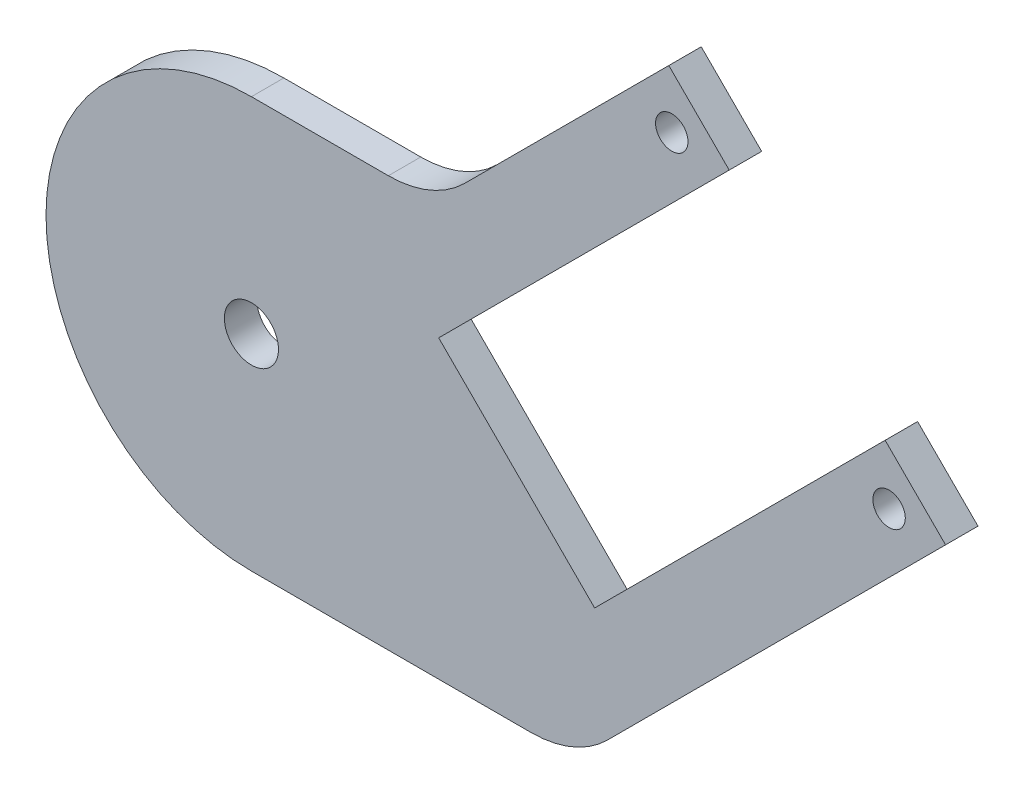
ISO-10303-21;
HEADER;
FILE_DESCRIPTION(('STEP AP214'),'2;1');
FILE_NAME('part.step','',(''),(''),'','','');
FILE_SCHEMA(('AUTOMOTIVE_DESIGN { 1 0 10303 214 1 1 1 1 }'));
ENDSEC;
DATA;
#1=APPLICATION_CONTEXT('core data for automotive mechanical design processes');
#2=APPLICATION_PROTOCOL_DEFINITION('international standard','automotive_design',2000,#1);
#3=PRODUCT_CONTEXT('',#1,'mechanical');
#4=PRODUCT('Part','Part','',(#3));
#5=PRODUCT_RELATED_PRODUCT_CATEGORY('part','',(#4));
#6=PRODUCT_DEFINITION_FORMATION('','',#4);
#7=PRODUCT_DEFINITION_CONTEXT('part definition',#1,'design');
#8=PRODUCT_DEFINITION('design','',#6,#7);
#9=PRODUCT_DEFINITION_SHAPE('','',#8);
#10=(LENGTH_UNIT() NAMED_UNIT(*) SI_UNIT(.MILLI.,.METRE.));
#11=(NAMED_UNIT(*) PLANE_ANGLE_UNIT() SI_UNIT($,.RADIAN.));
#12=(NAMED_UNIT(*) SI_UNIT($,.STERADIAN.) SOLID_ANGLE_UNIT());
#13=UNCERTAINTY_MEASURE_WITH_UNIT(LENGTH_MEASURE(1.E-05),#10,'distance_accuracy_value','');
#14=(GEOMETRIC_REPRESENTATION_CONTEXT(3) GLOBAL_UNCERTAINTY_ASSIGNED_CONTEXT((#13)) GLOBAL_UNIT_ASSIGNED_CONTEXT((#10,
#11,#12)) REPRESENTATION_CONTEXT('',''));
#15=CARTESIAN_POINT('',(0.,0.,0.));
#16=DIRECTION('',(0.,0.,1.));
#17=DIRECTION('',(1.,0.,0.));
#18=AXIS2_PLACEMENT_3D('',#15,#16,#17);
#19=CARTESIAN_POINT('',(0.,0.,3.));
#20=DIRECTION('',(0.,0.,1.));
#21=DIRECTION('',(1.,0.,0.));
#22=AXIS2_PLACEMENT_3D('',#19,#20,#21);
#23=PLANE('',#22);
#24=CARTESIAN_POINT('',(58.9776159145091,15.4753711382337,3.));
#25=DIRECTION('',(0.,0.,1.));
#26=DIRECTION('',(1.,0.,0.));
#27=AXIS2_PLACEMENT_3D('',#24,#25,#26);
#28=CIRCLE('',#27,1.5);
#29=CARTESIAN_POINT('',(60.4776159145091,15.4753711382337,3.));
#30=VERTEX_POINT('',#29);
#31=EDGE_CURVE('E291',#30,#30,#28,.T.);
#32=ORIENTED_EDGE('',*,*,#31,.F.);
#33=EDGE_LOOP('',(#32));
#34=FACE_BOUND('',#33,.T.);
#35=CARTESIAN_POINT('',(38.8781056592815,35.5748813934614,3.));
#36=DIRECTION('',(0.,0.,1.));
#37=DIRECTION('',(1.,0.,0.));
#38=AXIS2_PLACEMENT_3D('',#35,#36,#37);
#39=CIRCLE('',#38,1.5);
#40=CARTESIAN_POINT('',(40.3781056592815,35.5748813934614,3.));
#41=VERTEX_POINT('',#40);
#42=EDGE_CURVE('E293',#41,#41,#39,.T.);
#43=ORIENTED_EDGE('',*,*,#42,.F.);
#44=EDGE_LOOP('',(#43));
#45=FACE_BOUND('',#44,.T.);
#46=DIRECTION('',(1.,0.,0.));
#47=VECTOR('',#46,1.);
#48=CARTESIAN_POINT('',(0.,-19.,3.));
#49=LINE('',#48,#47);
#50=CARTESIAN_POINT('',(0.,-19.,3.));
#51=VERTEX_POINT('',#50);
#52=CARTESIAN_POINT('',(25.857864376269,-18.9999999999997,3.));
#53=VERTEX_POINT('',#52);
#54=EDGE_CURVE('E191',#51,#53,#49,.T.);
#55=ORIENTED_EDGE('',*,*,#54,.T.);
#56=CARTESIAN_POINT('',(25.8578643762689,-8.99999999999968,3.));
#57=DIRECTION('',(0.,0.,1.));
#58=DIRECTION('',(1.,0.,0.));
#59=AXIS2_PLACEMENT_3D('',#56,#57,#58);
#60=CIRCLE('',#59,10.);
#61=CARTESIAN_POINT('',(32.9289321881341,-16.0710678118654,3.));
#62=VERTEX_POINT('',#61);
#63=EDGE_CURVE('E164',#53,#62,#60,.T.);
#64=ORIENTED_EDGE('',*,*,#63,.T.);
#65=DIRECTION('',(0.707106781186574,0.707106781186521,0.));
#66=VECTOR('',#65,1.);
#67=CARTESIAN_POINT('',(29.9999999999996,-18.9999999999996,3.));
#68=LINE('',#67,#66);
#69=CARTESIAN_POINT('',(64.2013672605249,15.201367260523,3.));
#70=VERTEX_POINT('',#69);
#71=EDGE_CURVE('E196',#62,#70,#68,.T.);
#72=ORIENTED_EDGE('',*,*,#71,.T.);
#73=DIRECTION('',(-0.707106781186531,0.707106781186563,0.));
#74=VECTOR('',#73,1.);
#75=CARTESIAN_POINT('',(64.2013672605249,15.201367260523,3.));
#76=LINE('',#75,#74);
#77=CARTESIAN_POINT('',(58.6152236891513,20.7875108318968,3.));
#78=VERTEX_POINT('',#77);
#79=EDGE_CURVE('E198',#70,#78,#76,.T.);
#80=ORIENTED_EDGE('',*,*,#79,.T.);
#81=DIRECTION('',(-0.707106781186562,-0.707106781186533,0.));
#82=VECTOR('',#81,1.);
#83=CARTESIAN_POINT('',(31.745166004062,-6.08254685319135,3.));
#84=LINE('',#83,#82);
#85=CARTESIAN_POINT('',(31.745166004062,-6.08254685319135,3.));
#86=VERTEX_POINT('',#85);
#87=EDGE_CURVE('E200',#78,#86,#84,.T.);
#88=ORIENTED_EDGE('',*,*,#87,.T.);
#89=DIRECTION('',(-0.707106781186544,0.707106781186551,0.));
#90=VECTOR('',#89,1.);
#91=CARTESIAN_POINT('',(17.3201876678565,8.34243148301427,3.));
#92=LINE('',#91,#90);
#93=CARTESIAN_POINT('',(17.3201876678565,8.34243148301427,3.));
#94=VERTEX_POINT('',#93);
#95=EDGE_CURVE('E140',#86,#94,#92,.T.);
#96=ORIENTED_EDGE('',*,*,#95,.T.);
#97=DIRECTION('',(0.707106781186562,0.707106781186533,0.));
#98=VECTOR('',#97,1.);
#99=CARTESIAN_POINT('',(17.3201876678565,8.34243148301427,3.));
#100=LINE('',#99,#98);
#101=CARTESIAN_POINT('',(44.190245352946,35.2124891681027,3.));
#102=VERTEX_POINT('',#101);
#103=EDGE_CURVE('E135',#94,#102,#100,.T.);
#104=ORIENTED_EDGE('',*,*,#103,.T.);
#105=DIRECTION('',(-0.707106781186533,0.707106781186562,0.));
#106=VECTOR('',#105,1.);
#107=CARTESIAN_POINT('',(44.190245352946,35.2124891681027,3.));
#108=LINE('',#107,#106);
#109=CARTESIAN_POINT('',(38.6041017815724,40.7986327394765,3.));
#110=VERTEX_POINT('',#109);
#111=EDGE_CURVE('E123',#102,#110,#108,.T.);
#112=ORIENTED_EDGE('',*,*,#111,.T.);
#113=DIRECTION('',(-0.707106781186543,-0.707106781186552,0.));
#114=VECTOR('',#113,1.);
#115=CARTESIAN_POINT('',(38.6041017815724,40.7986327394765,3.));
#116=LINE('',#115,#114);
#117=CARTESIAN_POINT('',(19.7344012302307,21.9289321881346,3.));
#118=VERTEX_POINT('',#117);
#119=EDGE_CURVE('E134',#110,#118,#116,.T.);
#120=ORIENTED_EDGE('',*,*,#119,.T.);
#121=CARTESIAN_POINT('',(12.6633334183652,29.,3.));
#122=DIRECTION('',(0.,0.,1.));
#123=DIRECTION('',(1.,0.,0.));
#124=AXIS2_PLACEMENT_3D('',#121,#122,#123);
#125=CIRCLE('',#124,10.);
#126=CARTESIAN_POINT('',(12.6633334183652,19.,3.));
#127=VERTEX_POINT('',#126);
#128=EDGE_CURVE('E11',#118,#127,#125,.F.);
#129=ORIENTED_EDGE('',*,*,#128,.T.);
#130=DIRECTION('',(-1.,0.,0.));
#131=VECTOR('',#130,1.);
#132=CARTESIAN_POINT('',(16.8054690420962,19.,3.));
#133=LINE('',#132,#131);
#134=CARTESIAN_POINT('',(0.,19.,3.));
#135=VERTEX_POINT('',#134);
#136=EDGE_CURVE('E183',#127,#135,#133,.T.);
#137=ORIENTED_EDGE('',*,*,#136,.T.);
#138=CARTESIAN_POINT('',(0.,0.,3.));
#139=DIRECTION('',(0.,0.,1.));
#140=DIRECTION('',(1.,0.,0.));
#141=AXIS2_PLACEMENT_3D('',#138,#139,#140);
#142=CIRCLE('',#141,19.);
#143=EDGE_CURVE('E189',#135,#51,#142,.T.);
#144=ORIENTED_EDGE('',*,*,#143,.T.);
#145=EDGE_LOOP('',(#55,#64,#72,#80,#88,#96,#104,#112,#120,#129,#137,#144));
#146=FACE_BOUND('',#145,.T.);
#147=CARTESIAN_POINT('',(0.,0.,3.));
#148=DIRECTION('',(0.,0.,1.));
#149=DIRECTION('',(1.,0.,0.));
#150=AXIS2_PLACEMENT_3D('',#147,#148,#149);
#151=CIRCLE('',#150,2.5);
#152=CARTESIAN_POINT('',(2.5,0.,3.));
#153=VERTEX_POINT('',#152);
#154=EDGE_CURVE('E205',#153,#153,#151,.T.);
#155=ORIENTED_EDGE('',*,*,#154,.F.);
#156=EDGE_LOOP('',(#155));
#157=FACE_BOUND('',#156,.T.);
#158=ADVANCED_FACE('F33',(#34,#45,#146,#157),#23,.T.);
#159=CARTESIAN_POINT('',(0.,0.,0.));
#160=DIRECTION('',(0.,0.,1.));
#161=DIRECTION('',(1.,0.,0.));
#162=AXIS2_PLACEMENT_3D('',#159,#160,#161);
#163=PLANE('',#162);
#164=CARTESIAN_POINT('',(58.9776159145091,15.4753711382337,0.));
#165=DIRECTION('',(0.,0.,1.));
#166=DIRECTION('',(1.,0.,0.));
#167=AXIS2_PLACEMENT_3D('',#164,#165,#166);
#168=CIRCLE('',#167,1.5);
#169=CARTESIAN_POINT('',(60.4776159145091,15.4753711382337,0.));
#170=VERTEX_POINT('',#169);
#171=EDGE_CURVE('E289',#170,#170,#168,.T.);
#172=ORIENTED_EDGE('',*,*,#171,.T.);
#173=EDGE_LOOP('',(#172));
#174=FACE_BOUND('',#173,.T.);
#175=CARTESIAN_POINT('',(38.8781056592815,35.5748813934614,0.));
#176=DIRECTION('',(0.,0.,1.));
#177=DIRECTION('',(1.,0.,0.));
#178=AXIS2_PLACEMENT_3D('',#175,#176,#177);
#179=CIRCLE('',#178,1.5);
#180=CARTESIAN_POINT('',(40.3781056592815,35.5748813934614,0.));
#181=VERTEX_POINT('',#180);
#182=EDGE_CURVE('E296',#181,#181,#179,.T.);
#183=ORIENTED_EDGE('',*,*,#182,.T.);
#184=EDGE_LOOP('',(#183));
#185=FACE_BOUND('',#184,.T.);
#186=DIRECTION('',(0.707106781186574,0.707106781186521,0.));
#187=VECTOR('',#186,1.);
#188=CARTESIAN_POINT('',(29.9999999999996,-18.9999999999996,0.));
#189=LINE('',#188,#187);
#190=CARTESIAN_POINT('',(32.9289321881341,-16.0710678118654,0.));
#191=VERTEX_POINT('',#190);
#192=CARTESIAN_POINT('',(64.2013672605249,15.201367260523,0.));
#193=VERTEX_POINT('',#192);
#194=EDGE_CURVE('E212',#191,#193,#189,.T.);
#195=ORIENTED_EDGE('',*,*,#194,.F.);
#196=CARTESIAN_POINT('',(25.8578643762689,-8.99999999999968,0.));
#197=DIRECTION('',(0.,0.,1.));
#198=DIRECTION('',(1.,0.,0.));
#199=AXIS2_PLACEMENT_3D('',#196,#197,#198);
#200=CIRCLE('',#199,10.);
#201=CARTESIAN_POINT('',(25.857864376269,-18.9999999999997,0.));
#202=VERTEX_POINT('',#201);
#203=EDGE_CURVE('E56',#191,#202,#200,.F.);
#204=ORIENTED_EDGE('',*,*,#203,.T.);
#205=DIRECTION('',(1.,0.,0.));
#206=VECTOR('',#205,1.);
#207=CARTESIAN_POINT('',(0.,-19.,0.));
#208=LINE('',#207,#206);
#209=CARTESIAN_POINT('',(0.,-19.,0.));
#210=VERTEX_POINT('',#209);
#211=EDGE_CURVE('E210',#210,#202,#208,.T.);
#212=ORIENTED_EDGE('',*,*,#211,.F.);
#213=CARTESIAN_POINT('',(0.,0.,0.));
#214=DIRECTION('',(0.,0.,1.));
#215=DIRECTION('',(1.,0.,0.));
#216=AXIS2_PLACEMENT_3D('',#213,#214,#215);
#217=CIRCLE('',#216,19.);
#218=CARTESIAN_POINT('',(0.,19.,0.));
#219=VERTEX_POINT('',#218);
#220=EDGE_CURVE('E208',#219,#210,#217,.T.);
#221=ORIENTED_EDGE('',*,*,#220,.F.);
#222=DIRECTION('',(-1.,0.,0.));
#223=VECTOR('',#222,1.);
#224=CARTESIAN_POINT('',(16.8054690420962,19.,0.));
#225=LINE('',#224,#223);
#226=CARTESIAN_POINT('',(12.6633334183652,19.,0.));
#227=VERTEX_POINT('',#226);
#228=EDGE_CURVE('E172',#227,#219,#225,.T.);
#229=ORIENTED_EDGE('',*,*,#228,.F.);
#230=CARTESIAN_POINT('',(12.6633334183652,29.,0.));
#231=DIRECTION('',(0.,0.,1.));
#232=DIRECTION('',(1.,0.,0.));
#233=AXIS2_PLACEMENT_3D('',#230,#231,#232);
#234=CIRCLE('',#233,10.);
#235=CARTESIAN_POINT('',(19.7344012302307,21.9289321881346,0.));
#236=VERTEX_POINT('',#235);
#237=EDGE_CURVE('E41',#227,#236,#234,.T.);
#238=ORIENTED_EDGE('',*,*,#237,.T.);
#239=DIRECTION('',(-0.707106781186543,-0.707106781186552,0.));
#240=VECTOR('',#239,1.);
#241=CARTESIAN_POINT('',(38.6041017815724,40.7986327394765,0.));
#242=LINE('',#241,#240);
#243=CARTESIAN_POINT('',(38.6041017815724,40.7986327394765,0.));
#244=VERTEX_POINT('',#243);
#245=EDGE_CURVE('E170',#244,#236,#242,.T.);
#246=ORIENTED_EDGE('',*,*,#245,.F.);
#247=DIRECTION('',(-0.707106781186533,0.707106781186562,0.));
#248=VECTOR('',#247,1.);
#249=CARTESIAN_POINT('',(44.190245352946,35.2124891681027,0.));
#250=LINE('',#249,#248);
#251=CARTESIAN_POINT('',(44.190245352946,35.2124891681027,0.));
#252=VERTEX_POINT('',#251);
#253=EDGE_CURVE('E178',#252,#244,#250,.T.);
#254=ORIENTED_EDGE('',*,*,#253,.F.);
#255=DIRECTION('',(0.707106781186562,0.707106781186533,0.));
#256=VECTOR('',#255,1.);
#257=CARTESIAN_POINT('',(17.3201876678565,8.34243148301427,0.));
#258=LINE('',#257,#256);
#259=CARTESIAN_POINT('',(17.3201876678565,8.34243148301427,0.));
#260=VERTEX_POINT('',#259);
#261=EDGE_CURVE('E148',#260,#252,#258,.T.);
#262=ORIENTED_EDGE('',*,*,#261,.F.);
#263=DIRECTION('',(-0.707106781186544,0.707106781186551,0.));
#264=VECTOR('',#263,1.);
#265=CARTESIAN_POINT('',(17.3201876678565,8.34243148301427,0.));
#266=LINE('',#265,#264);
#267=CARTESIAN_POINT('',(31.745166004062,-6.08254685319135,0.));
#268=VERTEX_POINT('',#267);
#269=EDGE_CURVE('E144',#268,#260,#266,.T.);
#270=ORIENTED_EDGE('',*,*,#269,.F.);
#271=DIRECTION('',(-0.707106781186562,-0.707106781186533,0.));
#272=VECTOR('',#271,1.);
#273=CARTESIAN_POINT('',(31.745166004062,-6.08254685319135,0.));
#274=LINE('',#273,#272);
#275=CARTESIAN_POINT('',(58.6152236891513,20.7875108318968,0.));
#276=VERTEX_POINT('',#275);
#277=EDGE_CURVE('E216',#276,#268,#274,.T.);
#278=ORIENTED_EDGE('',*,*,#277,.F.);
#279=DIRECTION('',(-0.707106781186531,0.707106781186563,0.));
#280=VECTOR('',#279,1.);
#281=CARTESIAN_POINT('',(64.2013672605249,15.201367260523,0.));
#282=LINE('',#281,#280);
#283=EDGE_CURVE('E214',#193,#276,#282,.T.);
#284=ORIENTED_EDGE('',*,*,#283,.F.);
#285=EDGE_LOOP('',(#195,#204,#212,#221,#229,#238,#246,#254,#262,#270,#278,#284));
#286=FACE_BOUND('',#285,.T.);
#287=CARTESIAN_POINT('',(0.,0.,0.));
#288=DIRECTION('',(0.,0.,1.));
#289=DIRECTION('',(1.,0.,0.));
#290=AXIS2_PLACEMENT_3D('',#287,#288,#289);
#291=CIRCLE('',#290,2.5);
#292=CARTESIAN_POINT('',(2.5,0.,0.));
#293=VERTEX_POINT('',#292);
#294=EDGE_CURVE('E299',#293,#293,#291,.T.);
#295=ORIENTED_EDGE('',*,*,#294,.T.);
#296=EDGE_LOOP('',(#295));
#297=FACE_BOUND('',#296,.T.);
#298=ADVANCED_FACE('F168',(#174,#185,#286,#297),#163,.F.);
#299=CARTESIAN_POINT('',(17.3201876678565,8.34243148301427,3.));
#300=DIRECTION('',(-0.707106781186533,0.707106781186562,0.));
#301=DIRECTION('',(-0.707106781186562,-0.707106781186533,0.));
#302=AXIS2_PLACEMENT_3D('',#299,#300,#301);
#303=PLANE('',#302);
#304=ORIENTED_EDGE('',*,*,#261,.T.);
#305=DIRECTION('',(0.,0.,-1.));
#306=VECTOR('',#305,1.);
#307=CARTESIAN_POINT('',(44.190245352946,35.2124891681027,3.));
#308=LINE('',#307,#306);
#309=EDGE_CURVE('E127',#102,#252,#308,.T.);
#310=ORIENTED_EDGE('',*,*,#309,.F.);
#311=ORIENTED_EDGE('',*,*,#103,.F.);
#312=DIRECTION('',(0.,0.,-1.));
#313=VECTOR('',#312,1.);
#314=CARTESIAN_POINT('',(17.3201876678565,8.34243148301427,3.));
#315=LINE('',#314,#313);
#316=EDGE_CURVE('E203',#94,#260,#315,.T.);
#317=ORIENTED_EDGE('',*,*,#316,.T.);
#318=EDGE_LOOP('',(#304,#310,#311,#317));
#319=FACE_BOUND('',#318,.T.);
#320=ADVANCED_FACE('F146',(#319),#303,.F.);
#321=CARTESIAN_POINT('',(44.190245352946,35.2124891681027,3.));
#322=DIRECTION('',(-0.707106781186562,-0.707106781186533,0.));
#323=DIRECTION('',(0.707106781186533,-0.707106781186562,0.));
#324=AXIS2_PLACEMENT_3D('',#321,#322,#323);
#325=PLANE('',#324);
#326=ORIENTED_EDGE('',*,*,#253,.T.);
#327=DIRECTION('',(0.,0.,-1.));
#328=VECTOR('',#327,1.);
#329=CARTESIAN_POINT('',(38.6041017815724,40.7986327394765,3.));
#330=LINE('',#329,#328);
#331=EDGE_CURVE('E130',#110,#244,#330,.T.);
#332=ORIENTED_EDGE('',*,*,#331,.F.);
#333=ORIENTED_EDGE('',*,*,#111,.F.);
#334=ORIENTED_EDGE('',*,*,#309,.T.);
#335=EDGE_LOOP('',(#326,#332,#333,#334));
#336=FACE_BOUND('',#335,.T.);
#337=ADVANCED_FACE('F125',(#336),#325,.F.);
#338=CARTESIAN_POINT('',(38.6041017815724,40.7986327394765,3.));
#339=DIRECTION('',(0.707106781186552,-0.707106781186543,0.));
#340=DIRECTION('',(0.707106781186543,0.707106781186552,0.));
#341=AXIS2_PLACEMENT_3D('',#338,#339,#340);
#342=PLANE('',#341);
#343=ORIENTED_EDGE('',*,*,#245,.T.);
#344=DIRECTION('',(0.,0.,-1.));
#345=VECTOR('',#344,1.);
#346=CARTESIAN_POINT('',(19.7344012302307,21.9289321881346,3.));
#347=LINE('',#346,#345);
#348=EDGE_CURVE('E152',#236,#118,#347,.F.);
#349=ORIENTED_EDGE('',*,*,#348,.T.);
#350=ORIENTED_EDGE('',*,*,#119,.F.);
#351=ORIENTED_EDGE('',*,*,#331,.T.);
#352=EDGE_LOOP('',(#343,#349,#350,#351));
#353=FACE_BOUND('',#352,.T.);
#354=ADVANCED_FACE('F177',(#353),#342,.F.);
#355=CARTESIAN_POINT('',(16.8054690420962,19.,3.));
#356=DIRECTION('',(0.,-1.,0.));
#357=DIRECTION('',(0.,0.,-1.));
#358=AXIS2_PLACEMENT_3D('',#355,#356,#357);
#359=PLANE('',#358);
#360=ORIENTED_EDGE('',*,*,#136,.F.);
#361=DIRECTION('',(0.,0.,-1.));
#362=VECTOR('',#361,1.);
#363=CARTESIAN_POINT('',(12.6633334183652,19.,0.));
#364=LINE('',#363,#362);
#365=EDGE_CURVE('E149',#127,#227,#364,.T.);
#366=ORIENTED_EDGE('',*,*,#365,.T.);
#367=ORIENTED_EDGE('',*,*,#228,.T.);
#368=DIRECTION('',(0.,0.,-1.));
#369=VECTOR('',#368,1.);
#370=CARTESIAN_POINT('',(0.,19.,3.));
#371=LINE('',#370,#369);
#372=EDGE_CURVE('E154',#135,#219,#371,.T.);
#373=ORIENTED_EDGE('',*,*,#372,.F.);
#374=EDGE_LOOP('',(#360,#366,#367,#373));
#375=FACE_BOUND('',#374,.T.);
#376=ADVANCED_FACE('F186',(#375),#359,.F.);
#377=CARTESIAN_POINT('',(0.,0.,3.));
#378=DIRECTION('',(0.,0.,-1.));
#379=DIRECTION('',(-1.,0.,0.));
#380=AXIS2_PLACEMENT_3D('',#377,#378,#379);
#381=CYLINDRICAL_SURFACE('',#380,19.);
#382=ORIENTED_EDGE('',*,*,#220,.T.);
#383=DIRECTION('',(0.,0.,-1.));
#384=VECTOR('',#383,1.);
#385=CARTESIAN_POINT('',(0.,-19.,3.));
#386=LINE('',#385,#384);
#387=EDGE_CURVE('E229',#51,#210,#386,.T.);
#388=ORIENTED_EDGE('',*,*,#387,.F.);
#389=ORIENTED_EDGE('',*,*,#143,.F.);
#390=ORIENTED_EDGE('',*,*,#372,.T.);
#391=EDGE_LOOP('',(#382,#388,#389,#390));
#392=FACE_BOUND('',#391,.T.);
#393=ADVANCED_FACE('F232',(#392),#381,.T.);
#394=CARTESIAN_POINT('',(0.,-19.,3.));
#395=DIRECTION('',(0.,1.,0.));
#396=DIRECTION('',(-1.,0.,0.));
#397=AXIS2_PLACEMENT_3D('',#394,#395,#396);
#398=PLANE('',#397);
#399=ORIENTED_EDGE('',*,*,#211,.T.);
#400=DIRECTION('',(0.,0.,-1.));
#401=VECTOR('',#400,1.);
#402=CARTESIAN_POINT('',(25.857864376269,-18.9999999999997,3.));
#403=LINE('',#402,#401);
#404=EDGE_CURVE('E48',#202,#53,#403,.F.);
#405=ORIENTED_EDGE('',*,*,#404,.T.);
#406=ORIENTED_EDGE('',*,*,#54,.F.);
#407=ORIENTED_EDGE('',*,*,#387,.T.);
#408=EDGE_LOOP('',(#399,#405,#406,#407));
#409=FACE_BOUND('',#408,.T.);
#410=ADVANCED_FACE('F234',(#409),#398,.F.);
#411=CARTESIAN_POINT('',(29.9999999999996,-18.9999999999996,3.));
#412=DIRECTION('',(-0.707106781186521,0.707106781186574,0.));
#413=DIRECTION('',(-0.707106781186574,-0.707106781186521,0.));
#414=AXIS2_PLACEMENT_3D('',#411,#412,#413);
#415=PLANE('',#414);
#416=ORIENTED_EDGE('',*,*,#71,.F.);
#417=DIRECTION('',(0.,0.,-1.));
#418=VECTOR('',#417,1.);
#419=CARTESIAN_POINT('',(32.9289321881341,-16.0710678118654,3.));
#420=LINE('',#419,#418);
#421=EDGE_CURVE('E159',#62,#191,#420,.T.);
#422=ORIENTED_EDGE('',*,*,#421,.T.);
#423=ORIENTED_EDGE('',*,*,#194,.T.);
#424=DIRECTION('',(0.,0.,-1.));
#425=VECTOR('',#424,1.);
#426=CARTESIAN_POINT('',(64.2013672605249,15.201367260523,3.));
#427=LINE('',#426,#425);
#428=EDGE_CURVE('E226',#70,#193,#427,.T.);
#429=ORIENTED_EDGE('',*,*,#428,.F.);
#430=EDGE_LOOP('',(#416,#422,#423,#429));
#431=FACE_BOUND('',#430,.T.);
#432=ADVANCED_FACE('F241',(#431),#415,.F.);
#433=CARTESIAN_POINT('',(64.2013672605249,15.201367260523,3.));
#434=DIRECTION('',(-0.707106781186564,-0.707106781186531,0.));
#435=DIRECTION('',(0.707106781186531,-0.707106781186564,0.));
#436=AXIS2_PLACEMENT_3D('',#433,#434,#435);
#437=PLANE('',#436);
#438=ORIENTED_EDGE('',*,*,#283,.T.);
#439=DIRECTION('',(0.,0.,-1.));
#440=VECTOR('',#439,1.);
#441=CARTESIAN_POINT('',(58.6152236891513,20.7875108318968,3.));
#442=LINE('',#441,#440);
#443=EDGE_CURVE('E223',#78,#276,#442,.T.);
#444=ORIENTED_EDGE('',*,*,#443,.F.);
#445=ORIENTED_EDGE('',*,*,#79,.F.);
#446=ORIENTED_EDGE('',*,*,#428,.T.);
#447=EDGE_LOOP('',(#438,#444,#445,#446));
#448=FACE_BOUND('',#447,.T.);
#449=ADVANCED_FACE('F246',(#448),#437,.F.);
#450=CARTESIAN_POINT('',(31.745166004062,-6.08254685319135,3.));
#451=DIRECTION('',(0.707106781186533,-0.707106781186562,0.));
#452=DIRECTION('',(0.707106781186562,0.707106781186533,0.));
#453=AXIS2_PLACEMENT_3D('',#450,#451,#452);
#454=PLANE('',#453);
#455=ORIENTED_EDGE('',*,*,#277,.T.);
#456=DIRECTION('',(0.,0.,-1.));
#457=VECTOR('',#456,1.);
#458=CARTESIAN_POINT('',(31.745166004062,-6.08254685319135,3.));
#459=LINE('',#458,#457);
#460=EDGE_CURVE('E220',#86,#268,#459,.T.);
#461=ORIENTED_EDGE('',*,*,#460,.F.);
#462=ORIENTED_EDGE('',*,*,#87,.F.);
#463=ORIENTED_EDGE('',*,*,#443,.T.);
#464=EDGE_LOOP('',(#455,#461,#462,#463));
#465=FACE_BOUND('',#464,.T.);
#466=ADVANCED_FACE('F250',(#465),#454,.F.);
#467=CARTESIAN_POINT('',(17.3201876678565,8.34243148301427,3.));
#468=DIRECTION('',(-0.70710678118655,-0.707106781186544,0.));
#469=DIRECTION('',(0.707106781186545,-0.707106781186551,0.));
#470=AXIS2_PLACEMENT_3D('',#467,#468,#469);
#471=PLANE('',#470);
#472=ORIENTED_EDGE('',*,*,#269,.T.);
#473=ORIENTED_EDGE('',*,*,#316,.F.);
#474=ORIENTED_EDGE('',*,*,#95,.F.);
#475=ORIENTED_EDGE('',*,*,#460,.T.);
#476=EDGE_LOOP('',(#472,#473,#474,#475));
#477=FACE_BOUND('',#476,.T.);
#478=ADVANCED_FACE('F254',(#477),#471,.F.);
#479=CARTESIAN_POINT('',(0.,0.,3.));
#480=DIRECTION('',(0.,0.,-1.));
#481=DIRECTION('',(-1.,0.,0.));
#482=AXIS2_PLACEMENT_3D('',#479,#480,#481);
#483=CYLINDRICAL_SURFACE('',#482,2.5);
#484=ORIENTED_EDGE('',*,*,#154,.T.);
#485=EDGE_LOOP('',(#484));
#486=FACE_BOUND('',#485,.T.);
#487=ORIENTED_EDGE('',*,*,#294,.F.);
#488=EDGE_LOOP('',(#487));
#489=FACE_BOUND('',#488,.T.);
#490=ADVANCED_FACE('F256',(#486,#489),#483,.F.);
#491=CARTESIAN_POINT('',(38.8781056592815,35.5748813934614,0.));
#492=DIRECTION('',(0.,0.,1.));
#493=DIRECTION('',(1.,0.,0.));
#494=AXIS2_PLACEMENT_3D('',#491,#492,#493);
#495=CYLINDRICAL_SURFACE('',#494,1.5);
#496=ORIENTED_EDGE('',*,*,#182,.F.);
#497=EDGE_LOOP('',(#496));
#498=FACE_BOUND('',#497,.T.);
#499=ORIENTED_EDGE('',*,*,#42,.T.);
#500=EDGE_LOOP('',(#499));
#501=FACE_BOUND('',#500,.T.);
#502=ADVANCED_FACE('F262',(#498,#501),#495,.F.);
#503=CARTESIAN_POINT('',(58.9776159145091,15.4753711382337,0.));
#504=DIRECTION('',(0.,0.,1.));
#505=DIRECTION('',(1.,0.,0.));
#506=AXIS2_PLACEMENT_3D('',#503,#504,#505);
#507=CYLINDRICAL_SURFACE('',#506,1.5);
#508=ORIENTED_EDGE('',*,*,#171,.F.);
#509=EDGE_LOOP('',(#508));
#510=FACE_BOUND('',#509,.T.);
#511=ORIENTED_EDGE('',*,*,#31,.T.);
#512=EDGE_LOOP('',(#511));
#513=FACE_BOUND('',#512,.T.);
#514=ADVANCED_FACE('F279',(#510,#513),#507,.F.);
#515=CARTESIAN_POINT('',(12.6633334183652,29.,3.));
#516=DIRECTION('',(0.,0.,1.));
#517=DIRECTION('',(1.,0.,0.));
#518=AXIS2_PLACEMENT_3D('',#515,#516,#517);
#519=CYLINDRICAL_SURFACE('',#518,10.);
#520=ORIENTED_EDGE('',*,*,#128,.F.);
#521=ORIENTED_EDGE('',*,*,#348,.F.);
#522=ORIENTED_EDGE('',*,*,#237,.F.);
#523=ORIENTED_EDGE('',*,*,#365,.F.);
#524=EDGE_LOOP('',(#520,#521,#522,#523));
#525=FACE_BOUND('',#524,.T.);
#526=ADVANCED_FACE('F181',(#525),#519,.F.);
#527=CARTESIAN_POINT('',(25.8578643762689,-8.99999999999968,3.));
#528=DIRECTION('',(0.,0.,-1.));
#529=DIRECTION('',(-1.,0.,0.));
#530=AXIS2_PLACEMENT_3D('',#527,#528,#529);
#531=CYLINDRICAL_SURFACE('',#530,10.);
#532=ORIENTED_EDGE('',*,*,#63,.F.);
#533=ORIENTED_EDGE('',*,*,#404,.F.);
#534=ORIENTED_EDGE('',*,*,#203,.F.);
#535=ORIENTED_EDGE('',*,*,#421,.F.);
#536=EDGE_LOOP('',(#532,#533,#534,#535));
#537=FACE_BOUND('',#536,.T.);
#538=ADVANCED_FACE('F35',(#537),#531,.T.);
#539=CLOSED_SHELL('',(#158,#298,#320,#337,#354,#376,#393,#410,#432,#449,#466,#478,#490,#502,
#514,#526,#538));
#540=MANIFOLD_SOLID_BREP('B2',#539);
#541=ADVANCED_BREP_SHAPE_REPRESENTATION('',(#18,#540),#14);
#542=SHAPE_DEFINITION_REPRESENTATION(#9,#541);
ENDSEC;
END-ISO-10303-21;
